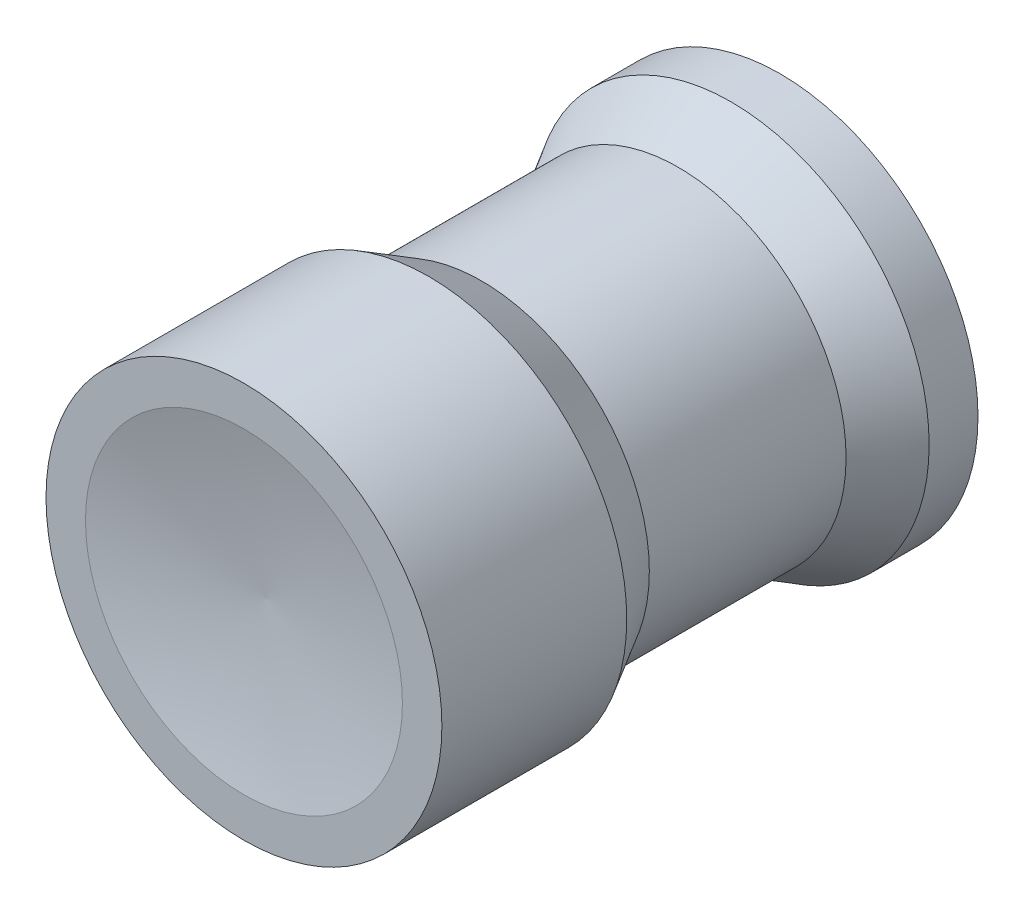
ISO-10303-21;
HEADER;
FILE_DESCRIPTION(('STEP AP214'),'2;1');
FILE_NAME('part.step','',(''),(''),'','','');
FILE_SCHEMA(('AUTOMOTIVE_DESIGN { 1 0 10303 214 1 1 1 1 }'));
ENDSEC;
DATA;
#1=APPLICATION_CONTEXT('core data for automotive mechanical design processes');
#2=APPLICATION_PROTOCOL_DEFINITION('international standard','automotive_design',2000,#1);
#3=PRODUCT_CONTEXT('',#1,'mechanical');
#4=PRODUCT('Part','Part','',(#3));
#5=PRODUCT_RELATED_PRODUCT_CATEGORY('part','',(#4));
#6=PRODUCT_DEFINITION_FORMATION('','',#4);
#7=PRODUCT_DEFINITION_CONTEXT('part definition',#1,'design');
#8=PRODUCT_DEFINITION('design','',#6,#7);
#9=PRODUCT_DEFINITION_SHAPE('','',#8);
#10=(LENGTH_UNIT() NAMED_UNIT(*) SI_UNIT(.MILLI.,.METRE.));
#11=(NAMED_UNIT(*) PLANE_ANGLE_UNIT() SI_UNIT($,.RADIAN.));
#12=(NAMED_UNIT(*) SI_UNIT($,.STERADIAN.) SOLID_ANGLE_UNIT());
#13=UNCERTAINTY_MEASURE_WITH_UNIT(LENGTH_MEASURE(1.E-05),#10,'distance_accuracy_value','');
#14=(GEOMETRIC_REPRESENTATION_CONTEXT(3) GLOBAL_UNCERTAINTY_ASSIGNED_CONTEXT((#13)) GLOBAL_UNIT_ASSIGNED_CONTEXT((#10,
#11,#12)) REPRESENTATION_CONTEXT('',''));
#15=CARTESIAN_POINT('',(0.,0.,0.));
#16=DIRECTION('',(0.,0.,1.));
#17=DIRECTION('',(1.,0.,0.));
#18=AXIS2_PLACEMENT_3D('',#15,#16,#17);
#19=CARTESIAN_POINT('',(-10.55,0.,-15.15));
#20=CARTESIAN_POINT('',(-10.55,-1.3808059349094,-15.15));
#21=CARTESIAN_POINT('',(-10.0006812451906,-4.14241780472816,-15.15));
#22=CARTESIAN_POINT('',(-7.6541900497974,-7.65419004979744,-15.15));
#23=CARTESIAN_POINT('',(-4.14241780472822,-10.0006812451906,-15.15));
#24=CARTESIAN_POINT('',(0.,-10.8246593774047,-15.15));
#25=CARTESIAN_POINT('',(4.14241780472819,-10.0006812451906,-15.15));
#26=CARTESIAN_POINT('',(7.65419004979743,-7.65419004979742,-15.15));
#27=CARTESIAN_POINT('',(10.0006812451906,-4.14241780472819,-15.15));
#28=CARTESIAN_POINT('',(10.8246593774047,0.,-15.15));
#29=CARTESIAN_POINT('',(10.0006812451906,4.14241780472819,-15.15));
#30=CARTESIAN_POINT('',(7.65419004979742,7.65419004979742,-15.15));
#31=CARTESIAN_POINT('',(4.14241780472818,10.0006812451906,-15.15));
#32=CARTESIAN_POINT('',(0.,10.8246593774047,-15.15));
#33=CARTESIAN_POINT('',(-4.14241780472819,10.0006812451906,-15.15));
#34=CARTESIAN_POINT('',(-7.65419004979743,7.65419004979741,-15.15));
#35=CARTESIAN_POINT('',(-10.0006812451906,4.14241780472822,-15.15));
#36=CARTESIAN_POINT('',(-10.55,1.3808059349094,-15.15));
#37=CARTESIAN_POINT('',(-10.55,0.,-15.15));
#38=CARTESIAN_POINT('',(-9.70900974233027,0.,-15.15));
#39=CARTESIAN_POINT('',(-9.70900974233027,-1.2707353814505,-15.15));
#40=CARTESIAN_POINT('',(-9.20347977625546,-3.81220614435148,-15.15));
#41=CARTESIAN_POINT('',(-7.04403846096023,-7.04403846096026,-15.15));
#42=CARTESIAN_POINT('',(-3.81220614435153,-9.20347977625543,-15.15));
#43=CARTESIAN_POINT('',(0.,-9.96177472536768,-15.15));
#44=CARTESIAN_POINT('',(3.8122061443515,-9.20347977625544,-15.15));
#45=CARTESIAN_POINT('',(7.04403846096025,-7.04403846096024,-15.15));
#46=CARTESIAN_POINT('',(9.20347977625545,-3.8122061443515,-15.15));
#47=CARTESIAN_POINT('',(9.96177472536768,0.,-15.15));
#48=CARTESIAN_POINT('',(9.20347977625544,3.8122061443515,-15.15));
#49=CARTESIAN_POINT('',(7.04403846096025,7.04403846096024,-15.15));
#50=CARTESIAN_POINT('',(3.8122061443515,9.20347977625545,-15.15));
#51=CARTESIAN_POINT('',(0.,9.96177472536768,-15.15));
#52=CARTESIAN_POINT('',(-3.8122061443515,9.20347977625544,-15.15));
#53=CARTESIAN_POINT('',(-7.04403846096025,7.04403846096023,-15.15));
#54=CARTESIAN_POINT('',(-9.20347977625543,3.81220614435153,-15.15));
#55=CARTESIAN_POINT('',(-9.70900974233026,1.2707353814505,-15.15));
#56=CARTESIAN_POINT('',(-9.70900974233027,0.,-15.15));
#57=CARTESIAN_POINT('',(-8.86801948466054,0.,-15.15));
#58=CARTESIAN_POINT('',(-8.86801948466054,-1.1606648279916,-15.15));
#59=CARTESIAN_POINT('',(-8.40627830732032,-3.48199448397479,-15.15));
#60=CARTESIAN_POINT('',(-6.43388687212305,-6.43388687212308,-15.15));
#61=CARTESIAN_POINT('',(-3.48199448397484,-8.4062783073203,-15.15));
#62=CARTESIAN_POINT('',(0.,-9.09889007333065,-15.15));
#63=CARTESIAN_POINT('',(3.48199448397481,-8.40627830732031,-15.15));
#64=CARTESIAN_POINT('',(6.43388687212307,-6.43388687212306,-15.15));
#65=CARTESIAN_POINT('',(8.40627830732031,-3.48199448397482,-15.15));
#66=CARTESIAN_POINT('',(9.09889007333065,0.,-15.15));
#67=CARTESIAN_POINT('',(8.4062783073203,3.48199448397482,-15.15));
#68=CARTESIAN_POINT('',(6.43388687212307,6.43388687212307,-15.15));
#69=CARTESIAN_POINT('',(3.48199448397481,8.40627830732031,-15.15));
#70=CARTESIAN_POINT('',(0.,9.09889007333065,-15.15));
#71=CARTESIAN_POINT('',(-3.48199448397482,8.40627830732031,-15.15));
#72=CARTESIAN_POINT('',(-6.43388687212308,6.43388687212305,-15.15));
#73=CARTESIAN_POINT('',(-8.4062783073203,3.48199448397484,-15.15));
#74=CARTESIAN_POINT('',(-8.86801948466053,1.16066482799161,-15.15));
#75=CARTESIAN_POINT('',(-8.86801948466054,0.,-15.15));
#76=CARTESIAN_POINT('',(-7.01446609406726,0.,-14.7915404008196));
#77=CARTESIAN_POINT('',(-7.01446609406726,-0.918067906436853,-14.7915404008196));
#78=CARTESIAN_POINT('',(-6.64923597269799,-2.75420371931054,-14.7915404008196));
#79=CARTESIAN_POINT('',(-5.08910488927497,-5.08910488927499,-14.7915404008196));
#80=CARTESIAN_POINT('',(-2.75420371931058,-6.64923597269797,-14.7915404008196));
#81=CARTESIAN_POINT('',(0.,-7.19708115475191,-14.7915404008196));
#82=CARTESIAN_POINT('',(2.75420371931056,-6.64923597269798,-14.7915404008196));
#83=CARTESIAN_POINT('',(5.08910488927499,-5.08910488927498,-14.7915404008196));
#84=CARTESIAN_POINT('',(6.64923597269798,-2.75420371931056,-14.7915404008196));
#85=CARTESIAN_POINT('',(7.19708115475191,0.,-14.7915404008196));
#86=CARTESIAN_POINT('',(6.64923597269798,2.75420371931056,-14.7915404008196));
#87=CARTESIAN_POINT('',(5.08910488927498,5.08910488927498,-14.7915404008196));
#88=CARTESIAN_POINT('',(2.75420371931056,6.64923597269798,-14.7915404008196));
#89=CARTESIAN_POINT('',(0.,7.19708115475191,-14.7915404008196));
#90=CARTESIAN_POINT('',(-2.75420371931056,6.64923597269798,-14.7915404008196));
#91=CARTESIAN_POINT('',(-5.08910488927498,5.08910488927497,-14.7915404008196));
#92=CARTESIAN_POINT('',(-6.64923597269798,2.75420371931059,-14.7915404008196));
#93=CARTESIAN_POINT('',(-7.01446609406726,0.918067906436855,-14.7915404008196));
#94=CARTESIAN_POINT('',(-7.01446609406726,0.,-14.7915404008196));
#95=CARTESIAN_POINT('',(-5.90845959918042,0.,-13.6855339059327));
#96=CARTESIAN_POINT('',(-5.90845959918042,-0.773311476845565,-13.6855339059327));
#97=CARTESIAN_POINT('',(-5.600817166018,-2.31993443053668,-13.6855339059327));
#98=CARTESIAN_POINT('',(-4.28667987428215,-4.28667987428217,-13.6855339059327));
#99=CARTESIAN_POINT('',(-2.31993443053672,-5.60081716601799,-13.6855339059327));
#100=CARTESIAN_POINT('',(0.,-6.06228081576163,-13.6855339059327));
#101=CARTESIAN_POINT('',(2.31993443053669,-5.60081716601799,-13.6855339059327));
#102=CARTESIAN_POINT('',(4.28667987428217,-4.28667987428216,-13.6855339059327));
#103=CARTESIAN_POINT('',(5.600817166018,-2.31993443053669,-13.6855339059327));
#104=CARTESIAN_POINT('',(6.06228081576163,0.,-13.6855339059327));
#105=CARTESIAN_POINT('',(5.60081716601799,2.3199344305367,-13.6855339059327));
#106=CARTESIAN_POINT('',(4.28667987428216,4.28667987428216,-13.6855339059327));
#107=CARTESIAN_POINT('',(2.31993443053669,5.600817166018,-13.6855339059327));
#108=CARTESIAN_POINT('',(0.,6.06228081576163,-13.6855339059327));
#109=CARTESIAN_POINT('',(-2.3199344305367,5.600817166018,-13.6855339059327));
#110=CARTESIAN_POINT('',(-4.28667987428216,4.28667987428215,-13.6855339059327));
#111=CARTESIAN_POINT('',(-5.600817166018,2.31993443053672,-13.6855339059327));
#112=CARTESIAN_POINT('',(-5.90845959918042,0.773311476845567,-13.6855339059327));
#113=CARTESIAN_POINT('',(-5.90845959918042,0.,-13.6855339059327));
#114=CARTESIAN_POINT('',(-5.55,0.,-11.8319805153395));
#115=CARTESIAN_POINT('',(-5.55,-0.726395539217739,-11.8319805153395));
#116=CARTESIAN_POINT('',(-5.26102188728036,-2.1791866176532,-11.8319805153395));
#117=CARTESIAN_POINT('',(-4.02661182714461,-4.02661182714462,-11.8319805153395));
#118=CARTESIAN_POINT('',(-2.17918661765324,-5.26102188728034,-11.8319805153395));
#119=CARTESIAN_POINT('',(0.,-5.69448905635983,-11.8319805153395));
#120=CARTESIAN_POINT('',(2.17918661765322,-5.26102188728035,-11.8319805153395));
#121=CARTESIAN_POINT('',(4.02661182714462,-4.02661182714461,-11.8319805153395));
#122=CARTESIAN_POINT('',(5.26102188728035,-2.17918661765322,-11.8319805153395));
#123=CARTESIAN_POINT('',(5.69448905635982,0.,-11.8319805153395));
#124=CARTESIAN_POINT('',(5.26102188728035,2.17918661765322,-11.8319805153395));
#125=CARTESIAN_POINT('',(4.02661182714462,4.02661182714461,-11.8319805153395));
#126=CARTESIAN_POINT('',(2.17918661765322,5.26102188728036,-11.8319805153395));
#127=CARTESIAN_POINT('',(0.,5.69448905635982,-11.8319805153395));
#128=CARTESIAN_POINT('',(-2.17918661765322,5.26102188728035,-11.8319805153395));
#129=CARTESIAN_POINT('',(-4.02661182714462,4.02661182714461,-11.8319805153395));
#130=CARTESIAN_POINT('',(-5.26102188728035,2.17918661765324,-11.8319805153395));
#131=CARTESIAN_POINT('',(-5.55,0.72639553921774,-11.8319805153395));
#132=CARTESIAN_POINT('',(-5.55,0.,-11.8319805153395));
#133=CARTESIAN_POINT('',(-5.55,0.,-10.9909902576697));
#134=CARTESIAN_POINT('',(-5.55,-0.726395539217739,-10.9909902576697));
#135=CARTESIAN_POINT('',(-5.26102188728036,-2.1791866176532,-10.9909902576697));
#136=CARTESIAN_POINT('',(-4.02661182714461,-4.02661182714462,-10.9909902576697));
#137=CARTESIAN_POINT('',(-2.17918661765324,-5.26102188728034,-10.9909902576697));
#138=CARTESIAN_POINT('',(0.,-5.69448905635983,-10.9909902576697));
#139=CARTESIAN_POINT('',(2.17918661765322,-5.26102188728035,-10.9909902576697));
#140=CARTESIAN_POINT('',(4.02661182714462,-4.02661182714461,-10.9909902576697));
#141=CARTESIAN_POINT('',(5.26102188728035,-2.17918661765322,-10.9909902576697));
#142=CARTESIAN_POINT('',(5.69448905635982,0.,-10.9909902576697));
#143=CARTESIAN_POINT('',(5.26102188728035,2.17918661765322,-10.9909902576697));
#144=CARTESIAN_POINT('',(4.02661182714462,4.02661182714461,-10.9909902576697));
#145=CARTESIAN_POINT('',(2.17918661765322,5.26102188728036,-10.9909902576697));
#146=CARTESIAN_POINT('',(0.,5.69448905635982,-10.9909902576697));
#147=CARTESIAN_POINT('',(-2.17918661765322,5.26102188728035,-10.9909902576697));
#148=CARTESIAN_POINT('',(-4.02661182714462,4.02661182714461,-10.9909902576697));
#149=CARTESIAN_POINT('',(-5.26102188728035,2.17918661765324,-10.9909902576697));
#150=CARTESIAN_POINT('',(-5.55,0.72639553921774,-10.9909902576697));
#151=CARTESIAN_POINT('',(-5.55,0.,-10.9909902576697));
#152=CARTESIAN_POINT('',(-5.55,0.,-10.15));
#153=CARTESIAN_POINT('',(-5.55,-0.726395539217739,-10.15));
#154=CARTESIAN_POINT('',(-5.26102188728036,-2.1791866176532,-10.15));
#155=CARTESIAN_POINT('',(-4.02661182714461,-4.02661182714462,-10.15));
#156=CARTESIAN_POINT('',(-2.17918661765324,-5.26102188728034,-10.15));
#157=CARTESIAN_POINT('',(0.,-5.69448905635983,-10.15));
#158=CARTESIAN_POINT('',(2.17918661765322,-5.26102188728035,-10.15));
#159=CARTESIAN_POINT('',(4.02661182714462,-4.02661182714461,-10.15));
#160=CARTESIAN_POINT('',(5.26102188728035,-2.17918661765322,-10.15));
#161=CARTESIAN_POINT('',(5.69448905635982,0.,-10.15));
#162=CARTESIAN_POINT('',(5.26102188728035,2.17918661765322,-10.15));
#163=CARTESIAN_POINT('',(4.02661182714462,4.02661182714461,-10.15));
#164=CARTESIAN_POINT('',(2.17918661765322,5.26102188728036,-10.15));
#165=CARTESIAN_POINT('',(0.,5.69448905635982,-10.15));
#166=CARTESIAN_POINT('',(-2.17918661765322,5.26102188728035,-10.15));
#167=CARTESIAN_POINT('',(-4.02661182714462,4.02661182714461,-10.15));
#168=CARTESIAN_POINT('',(-5.26102188728035,2.17918661765324,-10.15));
#169=CARTESIAN_POINT('',(-5.55,0.72639553921774,-10.15));
#170=CARTESIAN_POINT('',(-5.55,0.,-10.15));
#171=B_SPLINE_SURFACE_WITH_KNOTS('',5,3,((#19,#20,#21,#22,#23,#24,#25,#26,#27,#28,#29,#30,#31,
#32,#33,#34,#35,#36,#37),(#38,#39,#40,#41,#42,#43,#44,#45,#46,#47,#48,#49,#50,#51,#52,#53,#54,
#55,#56),(#57,#58,#59,#60,#61,#62,#63,#64,#65,#66,#67,#68,#69,#70,#71,#72,#73,#74,#75),(#76,#77,
#78,#79,#80,#81,#82,#83,#84,#85,#86,#87,#88,#89,#90,#91,#92,#93,#94),(#95,#96,#97,#98,#99,#100,
#101,#102,#103,#104,#105,#106,#107,#108,#109,#110,#111,#112,#113),(#114,#115,#116,#117,#118,
#119,#120,#121,#122,#123,#124,#125,#126,#127,#128,#129,#130,#131,#132),(#133,#134,#135,#136,
#137,#138,#139,#140,#141,#142,#143,#144,#145,#146,#147,#148,#149,#150,#151),(#152,#153,#154,
#155,#156,#157,#158,#159,#160,#161,#162,#163,#164,#165,#166,#167,#168,#169,#170)),.UNSPECIFIED.,
.F.,.T.,.F.,(6,2,6),(4,1,1,1,1,1,1,1,1,1,1,1,1,1,1,1,4),(0.,0.5,1.),(-3.14159265358979,
-2.74889357189107,-2.35619449019235,-1.96349540849362,-1.5707963267949,-1.17809724509617,
-0.785398163397448,-0.392699081698724,0.,0.392699081698724,0.785398163397448,1.17809724509617,
1.5707963267949,1.96349540849362,2.35619449019234,2.74889357189107,3.14159265358979),.UNSPECIFIED.);
#172=CARTESIAN_POINT('',(-5.55,0.,-10.15));
#173=CARTESIAN_POINT('',(-5.55,-0.726395539217739,-10.15));
#174=CARTESIAN_POINT('',(-5.26102188728036,-2.1791866176532,-10.15));
#175=CARTESIAN_POINT('',(-4.02661182714461,-4.02661182714462,-10.15));
#176=CARTESIAN_POINT('',(-2.17918661765324,-5.26102188728034,-10.15));
#177=CARTESIAN_POINT('',(0.,-5.69448905635983,-10.15));
#178=CARTESIAN_POINT('',(2.17918661765322,-5.26102188728035,-10.15));
#179=CARTESIAN_POINT('',(4.02661182714462,-4.02661182714461,-10.15));
#180=CARTESIAN_POINT('',(5.26102188728035,-2.17918661765322,-10.15));
#181=CARTESIAN_POINT('',(5.69448905635982,0.,-10.15));
#182=CARTESIAN_POINT('',(5.26102188728035,2.17918661765322,-10.15));
#183=CARTESIAN_POINT('',(4.02661182714462,4.02661182714461,-10.15));
#184=CARTESIAN_POINT('',(2.17918661765322,5.26102188728036,-10.15));
#185=CARTESIAN_POINT('',(0.,5.69448905635982,-10.15));
#186=CARTESIAN_POINT('',(-2.17918661765322,5.26102188728035,-10.15));
#187=CARTESIAN_POINT('',(-4.02661182714462,4.02661182714461,-10.15));
#188=CARTESIAN_POINT('',(-5.26102188728035,2.17918661765324,-10.15));
#189=CARTESIAN_POINT('',(-5.55,0.72639553921774,-10.15));
#190=CARTESIAN_POINT('',(-5.55,0.,-10.15));
#191=B_SPLINE_CURVE_WITH_KNOTS('',3,(#172,#173,#174,#175,#176,#177,#178,#179,#180,#181,#182,
#183,#184,#185,#186,#187,#188,#189,#190),.UNSPECIFIED.,.T.,.F.,(4,1,1,1,1,1,1,1,1,1,1,1,1,1,1,1,
4),(-3.14159265358979,-2.74889357189107,-2.35619449019235,-1.96349540849362,-1.5707963267949,
-1.17809724509617,-0.785398163397448,-0.392699081698724,0.,0.392699081698724,0.785398163397448,
1.17809724509617,1.5707963267949,1.96349540849362,2.35619449019234,2.74889357189107,
3.14159265358979),.UNSPECIFIED.);
#192=CARTESIAN_POINT('',(-5.55,0.,-10.15));
#193=VERTEX_POINT('',#192);
#194=EDGE_CURVE('E53',#193,#193,#191,.F.);
#195=CARTESIAN_POINT('',(-10.55,0.,-15.15));
#196=CARTESIAN_POINT('',(-10.55,1.3808059349094,-15.15));
#197=CARTESIAN_POINT('',(-10.0006812451906,4.14241780472822,-15.15));
#198=CARTESIAN_POINT('',(-7.65419004979743,7.65419004979741,-15.15));
#199=CARTESIAN_POINT('',(-4.14241780472819,10.0006812451906,-15.15));
#200=CARTESIAN_POINT('',(0.,10.8246593774047,-15.15));
#201=CARTESIAN_POINT('',(4.14241780472818,10.0006812451906,-15.15));
#202=CARTESIAN_POINT('',(7.65419004979742,7.65419004979742,-15.15));
#203=CARTESIAN_POINT('',(10.0006812451906,4.14241780472819,-15.15));
#204=CARTESIAN_POINT('',(10.8246593774047,0.,-15.15));
#205=CARTESIAN_POINT('',(10.0006812451906,-4.14241780472819,-15.15));
#206=CARTESIAN_POINT('',(7.65419004979743,-7.65419004979742,-15.15));
#207=CARTESIAN_POINT('',(4.14241780472819,-10.0006812451906,-15.15));
#208=CARTESIAN_POINT('',(0.,-10.8246593774047,-15.15));
#209=CARTESIAN_POINT('',(-4.14241780472822,-10.0006812451906,-15.15));
#210=CARTESIAN_POINT('',(-7.6541900497974,-7.65419004979744,-15.15));
#211=CARTESIAN_POINT('',(-10.0006812451906,-4.14241780472816,-15.15));
#212=CARTESIAN_POINT('',(-10.55,-1.3808059349094,-15.15));
#213=CARTESIAN_POINT('',(-10.55,0.,-15.15));
#214=B_SPLINE_CURVE_WITH_KNOTS('',3,(#195,#196,#197,#198,#199,#200,#201,#202,#203,#204,#205,
#206,#207,#208,#209,#210,#211,#212,#213),.UNSPECIFIED.,.T.,.F.,(4,1,1,1,1,1,1,1,1,1,1,1,1,1,1,1,
4),(-3.14159265358979,-2.74889357189107,-2.35619449019234,-1.96349540849362,-1.5707963267949,
-1.17809724509617,-0.785398163397448,-0.392699081698724,0.,0.392699081698724,0.785398163397448,
1.17809724509617,1.5707963267949,1.96349540849362,2.35619449019235,2.74889357189107,
3.14159265358979),.UNSPECIFIED.);
#215=CARTESIAN_POINT('',(-10.55,0.,-15.15));
#216=VERTEX_POINT('',#215);
#217=EDGE_CURVE('E11',#216,#216,#214,.F.);
#218=ORIENTED_EDGE('',*,*,#194,.F.);
#219=EDGE_LOOP('',(#218));
#220=FACE_BOUND('',#219,.T.);
#221=ORIENTED_EDGE('',*,*,#217,.F.);
#222=EDGE_LOOP('',(#221));
#223=FACE_BOUND('',#222,.T.);
#224=ADVANCED_FACE('F41',(#220,#223),#171,.T.);
#225=CARTESIAN_POINT('',(0.,0.,23.75));
#226=CARTESIAN_POINT('',(6.05702823701433,0.,24.106745248979));
#227=CARTESIAN_POINT('',(12.,0.,25.45));
#228=B_SPLINE_CURVE_WITH_KNOTS('',2,(#225,#226,#227),.UNSPECIFIED.,.F.,.F.,(3,3),(0.,1.),.UNSPECIFIED.);
#229=CARTESIAN_POINT('',(0.,0.,-30.5247513781348));
#230=DIRECTION('',(0.,0.,-1.));
#231=AXIS1_PLACEMENT('',#229,#230);
#232=SURFACE_OF_REVOLUTION('',#228,#231);
#233=CARTESIAN_POINT('',(0.,0.,25.45));
#234=DIRECTION('',(0.,0.,-1.));
#235=DIRECTION('',(-1.,0.,0.));
#236=AXIS2_PLACEMENT_3D('',#233,#234,#235);
#237=CIRCLE('',#236,12.);
#238=CARTESIAN_POINT('',(-12.,0.,25.45));
#239=VERTEX_POINT('',#238);
#240=EDGE_CURVE('E99',#239,#239,#237,.T.);
#241=ORIENTED_EDGE('',*,*,#240,.F.);
#242=EDGE_LOOP('',(#241));
#243=FACE_BOUND('',#242,.T.);
#244=CARTESIAN_POINT('',(0.,0.,23.75));
#245=VERTEX_POINT('',#244);
#246=VERTEX_LOOP('',#245);
#247=FACE_BOUND('',#246,.T.);
#248=ADVANCED_FACE('F56',(#243,#247),#232,.T.);
#249=CARTESIAN_POINT('',(14.99,0.,25.45));
#250=DIRECTION('',(0.,0.,-1.));
#251=DIRECTION('',(-1.,0.,0.));
#252=AXIS2_PLACEMENT_3D('',#249,#250,#251);
#253=PLANE('',#252);
#254=CARTESIAN_POINT('',(0.,0.,25.45));
#255=DIRECTION('',(0.,0.,-1.));
#256=DIRECTION('',(-1.,0.,0.));
#257=AXIS2_PLACEMENT_3D('',#254,#255,#256);
#258=CIRCLE('',#257,14.99);
#259=CARTESIAN_POINT('',(-14.99,0.,25.45));
#260=VERTEX_POINT('',#259);
#261=EDGE_CURVE('E96',#260,#260,#258,.T.);
#262=ORIENTED_EDGE('',*,*,#261,.F.);
#263=EDGE_LOOP('',(#262));
#264=FACE_BOUND('',#263,.T.);
#265=ORIENTED_EDGE('',*,*,#240,.T.);
#266=EDGE_LOOP('',(#265));
#267=FACE_BOUND('',#266,.T.);
#268=ADVANCED_FACE('F58',(#264,#267),#253,.F.);
#269=CARTESIAN_POINT('',(0.,0.,-30.5247513781348));
#270=DIRECTION('',(0.,0.,-1.));
#271=DIRECTION('',(-1.,0.,0.));
#272=AXIS2_PLACEMENT_3D('',#269,#270,#271);
#273=CYLINDRICAL_SURFACE('',#272,14.99);
#274=CARTESIAN_POINT('',(0.,0.,11.45));
#275=DIRECTION('',(0.,0.,-1.));
#276=DIRECTION('',(-1.,0.,0.));
#277=AXIS2_PLACEMENT_3D('',#274,#275,#276);
#278=CIRCLE('',#277,14.99);
#279=CARTESIAN_POINT('',(-14.99,0.,11.45));
#280=VERTEX_POINT('',#279);
#281=EDGE_CURVE('E93',#280,#280,#278,.T.);
#282=ORIENTED_EDGE('',*,*,#281,.F.);
#283=EDGE_LOOP('',(#282));
#284=FACE_BOUND('',#283,.T.);
#285=ORIENTED_EDGE('',*,*,#261,.T.);
#286=EDGE_LOOP('',(#285));
#287=FACE_BOUND('',#286,.T.);
#288=ADVANCED_FACE('F63',(#284,#287),#273,.T.);
#289=CARTESIAN_POINT('',(0.,0.,11.45));
#290=DIRECTION('',(0.,0.,1.));
#291=DIRECTION('',(1.,0.,0.));
#292=AXIS2_PLACEMENT_3D('',#289,#290,#291);
#293=CONICAL_SURFACE('',#292,14.99,0.519953433769729);
#294=CARTESIAN_POINT('',(0.,0.,7.44999999999999));
#295=DIRECTION('',(0.,0.,-1.));
#296=DIRECTION('',(-1.,0.,0.));
#297=AXIS2_PLACEMENT_3D('',#294,#295,#296);
#298=CIRCLE('',#297,12.7);
#299=CARTESIAN_POINT('',(-12.7,0.,7.44999999999999));
#300=VERTEX_POINT('',#299);
#301=EDGE_CURVE('E90',#300,#300,#298,.T.);
#302=ORIENTED_EDGE('',*,*,#301,.F.);
#303=EDGE_LOOP('',(#302));
#304=FACE_BOUND('',#303,.T.);
#305=ORIENTED_EDGE('',*,*,#281,.T.);
#306=EDGE_LOOP('',(#305));
#307=FACE_BOUND('',#306,.T.);
#308=ADVANCED_FACE('F167',(#304,#307),#293,.T.);
#309=CARTESIAN_POINT('',(0.,0.,-30.5247513781348));
#310=DIRECTION('',(0.,0.,-1.));
#311=DIRECTION('',(-1.,0.,0.));
#312=AXIS2_PLACEMENT_3D('',#309,#310,#311);
#313=CYLINDRICAL_SURFACE('',#312,12.7);
#314=CARTESIAN_POINT('',(0.,0.,-7.45));
#315=DIRECTION('',(0.,0.,-1.));
#316=DIRECTION('',(-1.,0.,0.));
#317=AXIS2_PLACEMENT_3D('',#314,#315,#316);
#318=CIRCLE('',#317,12.7);
#319=CARTESIAN_POINT('',(-12.7,0.,-7.45));
#320=VERTEX_POINT('',#319);
#321=EDGE_CURVE('E87',#320,#320,#318,.T.);
#322=ORIENTED_EDGE('',*,*,#321,.F.);
#323=EDGE_LOOP('',(#322));
#324=FACE_BOUND('',#323,.T.);
#325=ORIENTED_EDGE('',*,*,#301,.T.);
#326=EDGE_LOOP('',(#325));
#327=FACE_BOUND('',#326,.T.);
#328=ADVANCED_FACE('F162',(#324,#327),#313,.T.);
#329=CARTESIAN_POINT('',(0.,0.,-7.45));
#330=DIRECTION('',(0.,0.,-1.));
#331=DIRECTION('',(-1.,0.,0.));
#332=AXIS2_PLACEMENT_3D('',#329,#330,#331);
#333=CONICAL_SURFACE('',#332,12.7,0.519953433769729);
#334=CARTESIAN_POINT('',(0.,0.,-11.45));
#335=DIRECTION('',(0.,0.,-1.));
#336=DIRECTION('',(-1.,0.,0.));
#337=AXIS2_PLACEMENT_3D('',#334,#335,#336);
#338=CIRCLE('',#337,14.99);
#339=CARTESIAN_POINT('',(-14.99,0.,-11.45));
#340=VERTEX_POINT('',#339);
#341=EDGE_CURVE('E84',#340,#340,#338,.T.);
#342=ORIENTED_EDGE('',*,*,#341,.F.);
#343=EDGE_LOOP('',(#342));
#344=FACE_BOUND('',#343,.T.);
#345=ORIENTED_EDGE('',*,*,#321,.T.);
#346=EDGE_LOOP('',(#345));
#347=FACE_BOUND('',#346,.T.);
#348=ADVANCED_FACE('F157',(#344,#347),#333,.T.);
#349=CARTESIAN_POINT('',(0.,0.,-30.5247513781348));
#350=DIRECTION('',(0.,0.,-1.));
#351=DIRECTION('',(-1.,0.,0.));
#352=AXIS2_PLACEMENT_3D('',#349,#350,#351);
#353=CYLINDRICAL_SURFACE('',#352,14.99);
#354=CARTESIAN_POINT('',(0.,0.,-15.15));
#355=DIRECTION('',(0.,0.,-1.));
#356=DIRECTION('',(-1.,0.,0.));
#357=AXIS2_PLACEMENT_3D('',#354,#355,#356);
#358=CIRCLE('',#357,14.99);
#359=CARTESIAN_POINT('',(-14.99,0.,-15.15));
#360=VERTEX_POINT('',#359);
#361=EDGE_CURVE('E78',#360,#360,#358,.T.);
#362=ORIENTED_EDGE('',*,*,#361,.F.);
#363=EDGE_LOOP('',(#362));
#364=FACE_BOUND('',#363,.T.);
#365=ORIENTED_EDGE('',*,*,#341,.T.);
#366=EDGE_LOOP('',(#365));
#367=FACE_BOUND('',#366,.T.);
#368=ADVANCED_FACE('F131',(#364,#367),#353,.T.);
#369=CARTESIAN_POINT('',(2.,0.,-15.15));
#370=DIRECTION('',(0.,0.,1.));
#371=DIRECTION('',(1.,0.,0.));
#372=AXIS2_PLACEMENT_3D('',#369,#370,#371);
#373=PLANE('',#372);
#374=ORIENTED_EDGE('',*,*,#217,.T.);
#375=EDGE_LOOP('',(#374));
#376=FACE_BOUND('',#375,.T.);
#377=ORIENTED_EDGE('',*,*,#361,.T.);
#378=EDGE_LOOP('',(#377));
#379=FACE_BOUND('',#378,.T.);
#380=ADVANCED_FACE('F126',(#376,#379),#373,.F.);
#381=CARTESIAN_POINT('',(0.,0.,4.55));
#382=DIRECTION('',(0.,0.,-1.));
#383=DIRECTION('',(-1.,0.,0.));
#384=AXIS2_PLACEMENT_3D('',#381,#382,#383);
#385=CYLINDRICAL_SURFACE('',#384,5.55);
#386=ORIENTED_EDGE('',*,*,#194,.T.);
#387=EDGE_LOOP('',(#386));
#388=FACE_BOUND('',#387,.T.);
#389=CARTESIAN_POINT('',(0.,0.,4.55));
#390=DIRECTION('',(0.,0.,-1.));
#391=DIRECTION('',(-1.,0.,0.));
#392=AXIS2_PLACEMENT_3D('',#389,#390,#391);
#393=CIRCLE('',#392,5.55);
#394=CARTESIAN_POINT('',(-5.55,0.,4.55));
#395=VERTEX_POINT('',#394);
#396=EDGE_CURVE('E76',#395,#395,#393,.T.);
#397=ORIENTED_EDGE('',*,*,#396,.F.);
#398=EDGE_LOOP('',(#397));
#399=FACE_BOUND('',#398,.T.);
#400=ADVANCED_FACE('F115',(#388,#399),#385,.F.);
#401=CARTESIAN_POINT('',(0.,0.,4.55));
#402=DIRECTION('',(0.,0.,-1.));
#403=DIRECTION('',(-1.,0.,0.));
#404=AXIS2_PLACEMENT_3D('',#401,#402,#403);
#405=PLANE('',#404);
#406=CARTESIAN_POINT('',(0.,0.,4.55));
#407=DIRECTION('',(0.,0.,-1.));
#408=DIRECTION('',(-1.,0.,0.));
#409=AXIS2_PLACEMENT_3D('',#406,#407,#408);
#410=CIRCLE('',#409,2.475);
#411=CARTESIAN_POINT('',(-2.475,0.,4.55));
#412=VERTEX_POINT('',#411);
#413=EDGE_CURVE('E102',#412,#412,#410,.T.);
#414=ORIENTED_EDGE('',*,*,#413,.F.);
#415=EDGE_LOOP('',(#414));
#416=FACE_BOUND('',#415,.T.);
#417=ORIENTED_EDGE('',*,*,#396,.T.);
#418=EDGE_LOOP('',(#417));
#419=FACE_BOUND('',#418,.T.);
#420=ADVANCED_FACE('F125',(#416,#419),#405,.T.);
#421=CARTESIAN_POINT('',(0.,0.,9.85));
#422=DIRECTION('',(0.,0.,-1.));
#423=DIRECTION('',(-1.,0.,0.));
#424=AXIS2_PLACEMENT_3D('',#421,#422,#423);
#425=CYLINDRICAL_SURFACE('',#424,2.475);
#426=ORIENTED_EDGE('',*,*,#413,.T.);
#427=EDGE_LOOP('',(#426));
#428=FACE_BOUND('',#427,.T.);
#429=CARTESIAN_POINT('',(0.,0.,9.85));
#430=DIRECTION('',(0.,0.,-1.));
#431=DIRECTION('',(-1.,0.,0.));
#432=AXIS2_PLACEMENT_3D('',#429,#430,#431);
#433=CIRCLE('',#432,2.475);
#434=CARTESIAN_POINT('',(-2.475,0.,9.85));
#435=VERTEX_POINT('',#434);
#436=EDGE_CURVE('E105',#435,#435,#433,.T.);
#437=ORIENTED_EDGE('',*,*,#436,.F.);
#438=EDGE_LOOP('',(#437));
#439=FACE_BOUND('',#438,.T.);
#440=ADVANCED_FACE('F212',(#428,#439),#425,.F.);
#441=CARTESIAN_POINT('',(0.,0.,9.85));
#442=DIRECTION('',(0.,0.,-1.));
#443=DIRECTION('',(-1.,0.,0.));
#444=AXIS2_PLACEMENT_3D('',#441,#442,#443);
#445=PLANE('',#444);
#446=ORIENTED_EDGE('',*,*,#436,.T.);
#447=EDGE_LOOP('',(#446));
#448=FACE_BOUND('',#447,.T.);
#449=ADVANCED_FACE('F221',(#448),#445,.T.);
#450=CLOSED_SHELL('',(#224,#248,#268,#288,#308,#328,#348,#368,#380,#400,#420,#440,#449));
#451=MANIFOLD_SOLID_BREP('B2',#450);
#452=ADVANCED_BREP_SHAPE_REPRESENTATION('',(#18,#451),#14);
#453=SHAPE_DEFINITION_REPRESENTATION(#9,#452);
ENDSEC;
END-ISO-10303-21;
